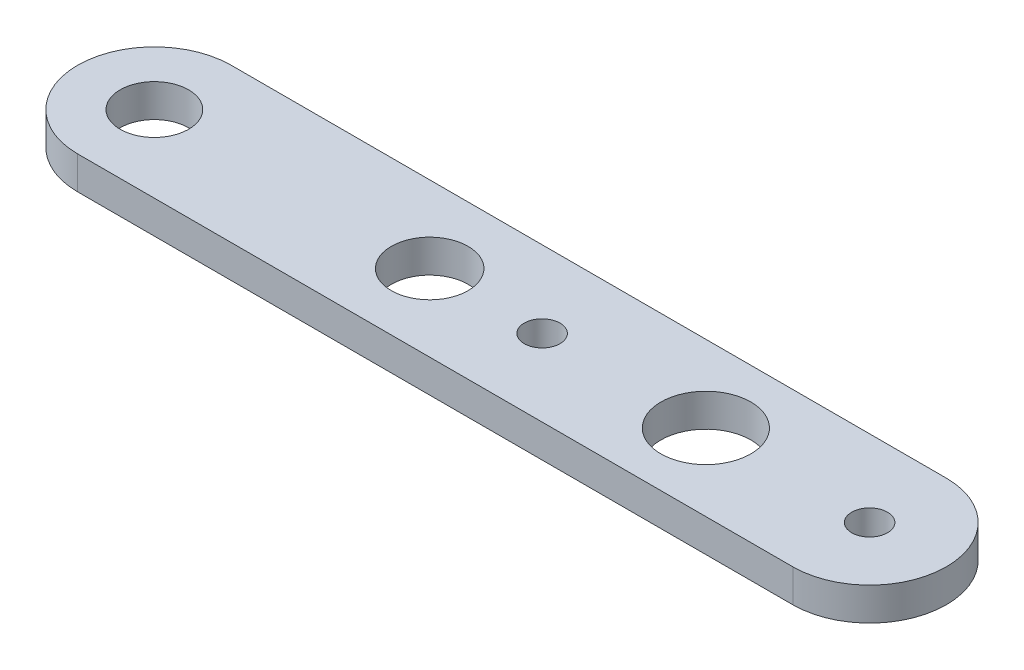
ISO-10303-21;
HEADER;
FILE_DESCRIPTION(('STEP AP214'),'2;1');
FILE_NAME('part.step','',(''),(''),'','','');
FILE_SCHEMA(('AUTOMOTIVE_DESIGN { 1 0 10303 214 1 1 1 1 }'));
ENDSEC;
DATA;
#1=APPLICATION_CONTEXT('core data for automotive mechanical design processes');
#2=APPLICATION_PROTOCOL_DEFINITION('international standard','automotive_design',2000,#1);
#3=PRODUCT_CONTEXT('',#1,'mechanical');
#4=PRODUCT('Part','Part','',(#3));
#5=PRODUCT_RELATED_PRODUCT_CATEGORY('part','',(#4));
#6=PRODUCT_DEFINITION_FORMATION('','',#4);
#7=PRODUCT_DEFINITION_CONTEXT('part definition',#1,'design');
#8=PRODUCT_DEFINITION('design','',#6,#7);
#9=PRODUCT_DEFINITION_SHAPE('','',#8);
#10=(LENGTH_UNIT() NAMED_UNIT(*) SI_UNIT(.MILLI.,.METRE.));
#11=(NAMED_UNIT(*) PLANE_ANGLE_UNIT() SI_UNIT($,.RADIAN.));
#12=(NAMED_UNIT(*) SI_UNIT($,.STERADIAN.) SOLID_ANGLE_UNIT());
#13=UNCERTAINTY_MEASURE_WITH_UNIT(LENGTH_MEASURE(1.E-05),#10,'distance_accuracy_value','');
#14=(GEOMETRIC_REPRESENTATION_CONTEXT(3) GLOBAL_UNCERTAINTY_ASSIGNED_CONTEXT((#13)) GLOBAL_UNIT_ASSIGNED_CONTEXT((#10,
#11,#12)) REPRESENTATION_CONTEXT('',''));
#15=CARTESIAN_POINT('',(0.,0.,0.));
#16=DIRECTION('',(0.,0.,1.));
#17=DIRECTION('',(1.,0.,0.));
#18=AXIS2_PLACEMENT_3D('',#15,#16,#17);
#19=CARTESIAN_POINT('',(0.,3.81,0.));
#20=DIRECTION('',(0.,1.,0.));
#21=DIRECTION('',(0.,0.,1.));
#22=AXIS2_PLACEMENT_3D('',#19,#20,#21);
#23=PLANE('',#22);
#24=CARTESIAN_POINT('',(63.8556,3.81,0.));
#25=DIRECTION('',(0.,1.,0.));
#26=DIRECTION('',(0.,0.,1.));
#27=AXIS2_PLACEMENT_3D('',#24,#25,#26);
#28=CIRCLE('',#27,5.20700000000001);
#29=CARTESIAN_POINT('',(63.8556,3.81,-5.20700000000001));
#30=VERTEX_POINT('',#29);
#31=EDGE_CURVE('E129',#30,#30,#28,.T.);
#32=ORIENTED_EDGE('',*,*,#31,.F.);
#33=EDGE_LOOP('',(#32));
#34=FACE_BOUND('',#33,.T.);
#35=CARTESIAN_POINT('',(82.8167,3.81,0.));
#36=DIRECTION('',(0.,1.,0.));
#37=DIRECTION('',(0.,0.,1.));
#38=AXIS2_PLACEMENT_3D('',#35,#36,#37);
#39=CIRCLE('',#38,2.0701);
#40=CARTESIAN_POINT('',(82.8167,3.81,-2.0701));
#41=VERTEX_POINT('',#40);
#42=EDGE_CURVE('E117',#41,#41,#39,.T.);
#43=ORIENTED_EDGE('',*,*,#42,.F.);
#44=EDGE_LOOP('',(#43));
#45=FACE_BOUND('',#44,.T.);
#46=CARTESIAN_POINT('',(0.,3.81,0.));
#47=DIRECTION('',(0.,1.,0.));
#48=DIRECTION('',(0.,0.,1.));
#49=AXIS2_PLACEMENT_3D('',#46,#47,#48);
#50=CIRCLE('',#49,8.89);
#51=CARTESIAN_POINT('',(0.,3.81,-8.89));
#52=VERTEX_POINT('',#51);
#53=CARTESIAN_POINT('',(0.,3.81,8.89));
#54=VERTEX_POINT('',#53);
#55=EDGE_CURVE('E87',#52,#54,#50,.T.);
#56=ORIENTED_EDGE('',*,*,#55,.T.);
#57=DIRECTION('',(1.,0.,0.));
#58=VECTOR('',#57,1.);
#59=CARTESIAN_POINT('',(0.,3.81,8.89));
#60=LINE('',#59,#58);
#61=CARTESIAN_POINT('',(82.8167,3.81,8.89));
#62=VERTEX_POINT('',#61);
#63=EDGE_CURVE('E82',#54,#62,#60,.T.);
#64=ORIENTED_EDGE('',*,*,#63,.T.);
#65=CARTESIAN_POINT('',(82.8167,3.81,0.));
#66=DIRECTION('',(0.,1.,0.));
#67=DIRECTION('',(0.,0.,1.));
#68=AXIS2_PLACEMENT_3D('',#65,#66,#67);
#69=CIRCLE('',#68,8.89);
#70=CARTESIAN_POINT('',(82.8167,3.81,-8.89));
#71=VERTEX_POINT('',#70);
#72=EDGE_CURVE('E85',#62,#71,#69,.T.);
#73=ORIENTED_EDGE('',*,*,#72,.T.);
#74=DIRECTION('',(-1.,0.,0.));
#75=VECTOR('',#74,1.);
#76=CARTESIAN_POINT('',(0.,3.81,-8.89));
#77=LINE('',#76,#75);
#78=EDGE_CURVE('E52',#71,#52,#77,.T.);
#79=ORIENTED_EDGE('',*,*,#78,.T.);
#80=EDGE_LOOP('',(#56,#64,#73,#79));
#81=FACE_BOUND('',#80,.T.);
#82=CARTESIAN_POINT('',(0.,3.81,0.));
#83=DIRECTION('',(0.,1.,0.));
#84=DIRECTION('',(0.,0.,1.));
#85=AXIS2_PLACEMENT_3D('',#82,#83,#84);
#86=CIRCLE('',#85,3.9624);
#87=CARTESIAN_POINT('',(0.,3.81,-3.9624));
#88=VERTEX_POINT('',#87);
#89=EDGE_CURVE('E102',#88,#88,#86,.T.);
#90=ORIENTED_EDGE('',*,*,#89,.F.);
#91=EDGE_LOOP('',(#90));
#92=FACE_BOUND('',#91,.T.);
#93=CARTESIAN_POINT('',(44.8945,3.81,0.));
#94=DIRECTION('',(0.,1.,0.));
#95=DIRECTION('',(0.,0.,1.));
#96=AXIS2_PLACEMENT_3D('',#93,#94,#95);
#97=CIRCLE('',#96,2.0701);
#98=CARTESIAN_POINT('',(44.8945,3.81,-2.07009999999999));
#99=VERTEX_POINT('',#98);
#100=EDGE_CURVE('E123',#99,#99,#97,.T.);
#101=ORIENTED_EDGE('',*,*,#100,.F.);
#102=EDGE_LOOP('',(#101));
#103=FACE_BOUND('',#102,.T.);
#104=CARTESIAN_POINT('',(31.877,3.81,0.));
#105=DIRECTION('',(0.,1.,0.));
#106=DIRECTION('',(0.,0.,1.));
#107=AXIS2_PLACEMENT_3D('',#104,#105,#106);
#108=CIRCLE('',#107,4.445);
#109=CARTESIAN_POINT('',(31.877,3.81,-4.445));
#110=VERTEX_POINT('',#109);
#111=EDGE_CURVE('E135',#110,#110,#108,.T.);
#112=ORIENTED_EDGE('',*,*,#111,.F.);
#113=EDGE_LOOP('',(#112));
#114=FACE_BOUND('',#113,.T.);
#115=ADVANCED_FACE('F35',(#34,#45,#81,#92,#103,#114),#23,.T.);
#116=CARTESIAN_POINT('',(0.,0.,0.));
#117=DIRECTION('',(0.,1.,0.));
#118=DIRECTION('',(0.,0.,1.));
#119=AXIS2_PLACEMENT_3D('',#116,#117,#118);
#120=PLANE('',#119);
#121=CARTESIAN_POINT('',(0.,0.,0.));
#122=DIRECTION('',(0.,1.,0.));
#123=DIRECTION('',(0.,0.,1.));
#124=AXIS2_PLACEMENT_3D('',#121,#122,#123);
#125=CIRCLE('',#124,8.89);
#126=CARTESIAN_POINT('',(0.,0.,-8.89));
#127=VERTEX_POINT('',#126);
#128=CARTESIAN_POINT('',(0.,0.,8.89));
#129=VERTEX_POINT('',#128);
#130=EDGE_CURVE('E99',#127,#129,#125,.T.);
#131=ORIENTED_EDGE('',*,*,#130,.F.);
#132=DIRECTION('',(-1.,0.,0.));
#133=VECTOR('',#132,1.);
#134=CARTESIAN_POINT('',(0.,0.,-8.89));
#135=LINE('',#134,#133);
#136=CARTESIAN_POINT('',(82.8167,0.,-8.89));
#137=VERTEX_POINT('',#136);
#138=EDGE_CURVE('E75',#137,#127,#135,.T.);
#139=ORIENTED_EDGE('',*,*,#138,.F.);
#140=CARTESIAN_POINT('',(82.8167,0.,0.));
#141=DIRECTION('',(0.,1.,0.));
#142=DIRECTION('',(0.,0.,1.));
#143=AXIS2_PLACEMENT_3D('',#140,#141,#142);
#144=CIRCLE('',#143,8.89);
#145=CARTESIAN_POINT('',(82.8167,0.,8.89));
#146=VERTEX_POINT('',#145);
#147=EDGE_CURVE('E69',#146,#137,#144,.T.);
#148=ORIENTED_EDGE('',*,*,#147,.F.);
#149=DIRECTION('',(1.,0.,0.));
#150=VECTOR('',#149,1.);
#151=CARTESIAN_POINT('',(0.,0.,8.89));
#152=LINE('',#151,#150);
#153=EDGE_CURVE('E91',#129,#146,#152,.T.);
#154=ORIENTED_EDGE('',*,*,#153,.F.);
#155=EDGE_LOOP('',(#131,#139,#148,#154));
#156=FACE_BOUND('',#155,.T.);
#157=CARTESIAN_POINT('',(0.,0.,0.));
#158=DIRECTION('',(0.,1.,0.));
#159=DIRECTION('',(0.,0.,1.));
#160=AXIS2_PLACEMENT_3D('',#157,#158,#159);
#161=CIRCLE('',#160,3.9624);
#162=CARTESIAN_POINT('',(0.,0.,-3.9624));
#163=VERTEX_POINT('',#162);
#164=EDGE_CURVE('E114',#163,#163,#161,.T.);
#165=ORIENTED_EDGE('',*,*,#164,.T.);
#166=EDGE_LOOP('',(#165));
#167=FACE_BOUND('',#166,.T.);
#168=CARTESIAN_POINT('',(82.8167,0.,0.));
#169=DIRECTION('',(0.,1.,0.));
#170=DIRECTION('',(0.,0.,1.));
#171=AXIS2_PLACEMENT_3D('',#168,#169,#170);
#172=CIRCLE('',#171,2.0701);
#173=CARTESIAN_POINT('',(82.8167,0.,-2.0701));
#174=VERTEX_POINT('',#173);
#175=EDGE_CURVE('E120',#174,#174,#172,.T.);
#176=ORIENTED_EDGE('',*,*,#175,.T.);
#177=EDGE_LOOP('',(#176));
#178=FACE_BOUND('',#177,.T.);
#179=CARTESIAN_POINT('',(44.8945,0.,0.));
#180=DIRECTION('',(0.,1.,0.));
#181=DIRECTION('',(0.,0.,1.));
#182=AXIS2_PLACEMENT_3D('',#179,#180,#181);
#183=CIRCLE('',#182,2.0701);
#184=CARTESIAN_POINT('',(44.8945,0.,-2.07009999999999));
#185=VERTEX_POINT('',#184);
#186=EDGE_CURVE('E126',#185,#185,#183,.T.);
#187=ORIENTED_EDGE('',*,*,#186,.T.);
#188=EDGE_LOOP('',(#187));
#189=FACE_BOUND('',#188,.T.);
#190=CARTESIAN_POINT('',(63.8556,0.,0.));
#191=DIRECTION('',(0.,1.,0.));
#192=DIRECTION('',(0.,0.,1.));
#193=AXIS2_PLACEMENT_3D('',#190,#191,#192);
#194=CIRCLE('',#193,5.20700000000001);
#195=CARTESIAN_POINT('',(63.8556,0.,-5.20700000000001));
#196=VERTEX_POINT('',#195);
#197=EDGE_CURVE('E132',#196,#196,#194,.T.);
#198=ORIENTED_EDGE('',*,*,#197,.T.);
#199=EDGE_LOOP('',(#198));
#200=FACE_BOUND('',#199,.T.);
#201=CARTESIAN_POINT('',(31.877,0.,0.));
#202=DIRECTION('',(0.,1.,0.));
#203=DIRECTION('',(0.,0.,1.));
#204=AXIS2_PLACEMENT_3D('',#201,#202,#203);
#205=CIRCLE('',#204,4.445);
#206=CARTESIAN_POINT('',(31.877,0.,-4.445));
#207=VERTEX_POINT('',#206);
#208=EDGE_CURVE('E138',#207,#207,#205,.T.);
#209=ORIENTED_EDGE('',*,*,#208,.T.);
#210=EDGE_LOOP('',(#209));
#211=FACE_BOUND('',#210,.T.);
#212=ADVANCED_FACE('F110',(#156,#167,#178,#189,#200,#211),#120,.F.);
#213=CARTESIAN_POINT('',(0.,3.81,0.));
#214=DIRECTION('',(0.,-1.,0.));
#215=DIRECTION('',(0.,0.,-1.));
#216=AXIS2_PLACEMENT_3D('',#213,#214,#215);
#217=CYLINDRICAL_SURFACE('',#216,8.89);
#218=ORIENTED_EDGE('',*,*,#130,.T.);
#219=DIRECTION('',(0.,-1.,0.));
#220=VECTOR('',#219,1.);
#221=CARTESIAN_POINT('',(0.,3.81,8.89));
#222=LINE('',#221,#220);
#223=EDGE_CURVE('E11',#54,#129,#222,.T.);
#224=ORIENTED_EDGE('',*,*,#223,.F.);
#225=ORIENTED_EDGE('',*,*,#55,.F.);
#226=DIRECTION('',(0.,-1.,0.));
#227=VECTOR('',#226,1.);
#228=CARTESIAN_POINT('',(0.,3.81,-8.89));
#229=LINE('',#228,#227);
#230=EDGE_CURVE('E95',#52,#127,#229,.T.);
#231=ORIENTED_EDGE('',*,*,#230,.T.);
#232=EDGE_LOOP('',(#218,#224,#225,#231));
#233=FACE_BOUND('',#232,.T.);
#234=ADVANCED_FACE('F37',(#233),#217,.T.);
#235=CARTESIAN_POINT('',(0.,3.81,8.89));
#236=DIRECTION('',(0.,0.,-1.));
#237=DIRECTION('',(-1.,0.,0.));
#238=AXIS2_PLACEMENT_3D('',#235,#236,#237);
#239=PLANE('',#238);
#240=ORIENTED_EDGE('',*,*,#153,.T.);
#241=DIRECTION('',(0.,-1.,0.));
#242=VECTOR('',#241,1.);
#243=CARTESIAN_POINT('',(82.8167,3.81,8.89));
#244=LINE('',#243,#242);
#245=EDGE_CURVE('E44',#62,#146,#244,.T.);
#246=ORIENTED_EDGE('',*,*,#245,.F.);
#247=ORIENTED_EDGE('',*,*,#63,.F.);
#248=ORIENTED_EDGE('',*,*,#223,.T.);
#249=EDGE_LOOP('',(#240,#246,#247,#248));
#250=FACE_BOUND('',#249,.T.);
#251=ADVANCED_FACE('F90',(#250),#239,.F.);
#252=CARTESIAN_POINT('',(82.8167,3.81,0.));
#253=DIRECTION('',(0.,-1.,0.));
#254=DIRECTION('',(0.,0.,-1.));
#255=AXIS2_PLACEMENT_3D('',#252,#253,#254);
#256=CYLINDRICAL_SURFACE('',#255,8.89);
#257=ORIENTED_EDGE('',*,*,#147,.T.);
#258=DIRECTION('',(0.,-1.,0.));
#259=VECTOR('',#258,1.);
#260=CARTESIAN_POINT('',(82.8167,3.81,-8.89));
#261=LINE('',#260,#259);
#262=EDGE_CURVE('E92',#71,#137,#261,.T.);
#263=ORIENTED_EDGE('',*,*,#262,.F.);
#264=ORIENTED_EDGE('',*,*,#72,.F.);
#265=ORIENTED_EDGE('',*,*,#245,.T.);
#266=EDGE_LOOP('',(#257,#263,#264,#265));
#267=FACE_BOUND('',#266,.T.);
#268=ADVANCED_FACE('F93',(#267),#256,.T.);
#269=CARTESIAN_POINT('',(0.,3.81,-8.89));
#270=DIRECTION('',(0.,0.,1.));
#271=DIRECTION('',(1.,0.,0.));
#272=AXIS2_PLACEMENT_3D('',#269,#270,#271);
#273=PLANE('',#272);
#274=ORIENTED_EDGE('',*,*,#138,.T.);
#275=ORIENTED_EDGE('',*,*,#230,.F.);
#276=ORIENTED_EDGE('',*,*,#78,.F.);
#277=ORIENTED_EDGE('',*,*,#262,.T.);
#278=EDGE_LOOP('',(#274,#275,#276,#277));
#279=FACE_BOUND('',#278,.T.);
#280=ADVANCED_FACE('F107',(#279),#273,.F.);
#281=CARTESIAN_POINT('',(0.,3.81,0.));
#282=DIRECTION('',(0.,-1.,0.));
#283=DIRECTION('',(0.,0.,-1.));
#284=AXIS2_PLACEMENT_3D('',#281,#282,#283);
#285=CYLINDRICAL_SURFACE('',#284,3.9624);
#286=CARTESIAN_POINT('',(0.,3.81,-3.9624));
#287=CARTESIAN_POINT('',(0.,3.7703125,-3.9624));
#288=CARTESIAN_POINT('',(0.,3.730625,-3.9624));
#289=CARTESIAN_POINT('',(0.,3.65125,-3.9624));
#290=CARTESIAN_POINT('',(0.,3.6115625,-3.9624));
#291=CARTESIAN_POINT('',(0.,3.5321875,-3.9624));
#292=CARTESIAN_POINT('',(0.,3.4925,-3.9624));
#293=CARTESIAN_POINT('',(0.,3.413125,-3.9624));
#294=CARTESIAN_POINT('',(0.,3.3734375,-3.9624));
#295=CARTESIAN_POINT('',(0.,3.2940625,-3.9624));
#296=CARTESIAN_POINT('',(0.,3.254375,-3.9624));
#297=CARTESIAN_POINT('',(0.,3.175,-3.9624));
#298=CARTESIAN_POINT('',(0.,3.1353125,-3.9624));
#299=CARTESIAN_POINT('',(0.,3.0559375,-3.9624));
#300=CARTESIAN_POINT('',(0.,3.01625,-3.9624));
#301=CARTESIAN_POINT('',(0.,2.936875,-3.9624));
#302=CARTESIAN_POINT('',(0.,2.8971875,-3.9624));
#303=CARTESIAN_POINT('',(0.,2.8178125,-3.9624));
#304=CARTESIAN_POINT('',(0.,2.778125,-3.9624));
#305=CARTESIAN_POINT('',(0.,2.69875,-3.9624));
#306=CARTESIAN_POINT('',(0.,2.6590625,-3.9624));
#307=CARTESIAN_POINT('',(0.,2.5796875,-3.9624));
#308=CARTESIAN_POINT('',(0.,2.54,-3.9624));
#309=CARTESIAN_POINT('',(0.,2.460625,-3.9624));
#310=CARTESIAN_POINT('',(0.,2.4209375,-3.9624));
#311=CARTESIAN_POINT('',(0.,2.3415625,-3.9624));
#312=CARTESIAN_POINT('',(0.,2.301875,-3.9624));
#313=CARTESIAN_POINT('',(0.,2.2225,-3.9624));
#314=CARTESIAN_POINT('',(0.,2.1828125,-3.9624));
#315=CARTESIAN_POINT('',(0.,2.1034375,-3.9624));
#316=CARTESIAN_POINT('',(0.,2.06375,-3.9624));
#317=CARTESIAN_POINT('',(0.,1.984375,-3.9624));
#318=CARTESIAN_POINT('',(0.,1.9446875,-3.9624));
#319=CARTESIAN_POINT('',(0.,1.8653125,-3.9624));
#320=CARTESIAN_POINT('',(0.,1.825625,-3.9624));
#321=CARTESIAN_POINT('',(0.,1.74625,-3.9624));
#322=CARTESIAN_POINT('',(0.,1.7065625,-3.9624));
#323=CARTESIAN_POINT('',(0.,1.6271875,-3.9624));
#324=CARTESIAN_POINT('',(0.,1.5875,-3.9624));
#325=CARTESIAN_POINT('',(0.,1.508125,-3.9624));
#326=CARTESIAN_POINT('',(0.,1.4684375,-3.9624));
#327=CARTESIAN_POINT('',(0.,1.3890625,-3.9624));
#328=CARTESIAN_POINT('',(0.,1.349375,-3.9624));
#329=CARTESIAN_POINT('',(0.,1.27,-3.9624));
#330=CARTESIAN_POINT('',(0.,1.2303125,-3.9624));
#331=CARTESIAN_POINT('',(0.,1.1509375,-3.9624));
#332=CARTESIAN_POINT('',(0.,1.11125,-3.9624));
#333=CARTESIAN_POINT('',(0.,1.031875,-3.9624));
#334=CARTESIAN_POINT('',(0.,0.9921875,-3.9624));
#335=CARTESIAN_POINT('',(0.,0.9128125,-3.9624));
#336=CARTESIAN_POINT('',(0.,0.873125,-3.9624));
#337=CARTESIAN_POINT('',(0.,0.79375,-3.9624));
#338=CARTESIAN_POINT('',(0.,0.7540625,-3.9624));
#339=CARTESIAN_POINT('',(0.,0.6746875,-3.9624));
#340=CARTESIAN_POINT('',(0.,0.635,-3.9624));
#341=CARTESIAN_POINT('',(0.,0.555625,-3.9624));
#342=CARTESIAN_POINT('',(0.,0.5159375,-3.9624));
#343=CARTESIAN_POINT('',(0.,0.4365625,-3.9624));
#344=CARTESIAN_POINT('',(0.,0.396875,-3.9624));
#345=CARTESIAN_POINT('',(0.,0.3175,-3.9624));
#346=CARTESIAN_POINT('',(0.,0.2778125,-3.9624));
#347=CARTESIAN_POINT('',(0.,0.1984375,-3.9624));
#348=CARTESIAN_POINT('',(0.,0.15875,-3.9624));
#349=CARTESIAN_POINT('',(0.,0.0793749999999999,-3.9624));
#350=CARTESIAN_POINT('',(0.,0.0396874999999999,-3.9624));
#351=CARTESIAN_POINT('',(0.,0.,-3.9624));
#352=B_SPLINE_CURVE_WITH_KNOTS('',3,(#286,#287,#288,#289,#290,#291,#292,#293,#294,#295,#296,
#297,#298,#299,#300,#301,#302,#303,#304,#305,#306,#307,#308,#309,#310,#311,#312,#313,#314,#315,
#316,#317,#318,#319,#320,#321,#322,#323,#324,#325,#326,#327,#328,#329,#330,#331,#332,#333,#334,
#335,#336,#337,#338,#339,#340,#341,#342,#343,#344,#345,#346,#347,#348,#349,#350,#351),
.UNSPECIFIED.,.F.,.F.,(4,2,2,2,2,2,2,2,2,2,2,2,2,2,2,2,2,2,2,2,2,2,2,2,2,2,2,2,2,2,2,2,4),(0.,
0.1190625,0.238125,0.3571875,0.47625,0.595312499999999,0.714375,0.833437499999999,
0.952499999999999,1.0715625,1.190625,1.3096875,1.42875,1.5478125,1.666875,1.7859375,1.905,
2.0240625,2.143125,2.2621875,2.38125,2.5003125,2.619375,2.7384375,2.8575,2.9765625,3.095625,
3.2146875,3.33375,3.4528125,3.571875,3.6909375,3.81),.UNSPECIFIED.);
#353=EDGE_CURVE('BSEAM157',#88,#163,#352,.T.);
#354=ORIENTED_EDGE('',*,*,#89,.T.);
#355=ORIENTED_EDGE('',*,*,#164,.F.);
#356=ORIENTED_EDGE('',*,*,#353,.T.);
#357=ORIENTED_EDGE('',*,*,#353,.F.);
#358=EDGE_LOOP('',(#354,#356,#355,#357));
#359=FACE_BOUND('',#358,.T.);
#360=ADVANCED_FACE('F157',(#359),#285,.F.);
#361=CARTESIAN_POINT('',(82.8167,3.81,0.));
#362=DIRECTION('',(0.,-1.,0.));
#363=DIRECTION('',(0.,0.,-1.));
#364=AXIS2_PLACEMENT_3D('',#361,#362,#363);
#365=CYLINDRICAL_SURFACE('',#364,2.0701);
#366=CARTESIAN_POINT('',(82.8167,3.81,-2.0701));
#367=CARTESIAN_POINT('',(82.8167,3.7703125,-2.0701));
#368=CARTESIAN_POINT('',(82.8167,3.730625,-2.0701));
#369=CARTESIAN_POINT('',(82.8167,3.65125,-2.0701));
#370=CARTESIAN_POINT('',(82.8167,3.6115625,-2.0701));
#371=CARTESIAN_POINT('',(82.8167,3.5321875,-2.0701));
#372=CARTESIAN_POINT('',(82.8167,3.4925,-2.0701));
#373=CARTESIAN_POINT('',(82.8167,3.413125,-2.0701));
#374=CARTESIAN_POINT('',(82.8167,3.3734375,-2.0701));
#375=CARTESIAN_POINT('',(82.8167,3.2940625,-2.0701));
#376=CARTESIAN_POINT('',(82.8167,3.254375,-2.0701));
#377=CARTESIAN_POINT('',(82.8167,3.175,-2.0701));
#378=CARTESIAN_POINT('',(82.8167,3.1353125,-2.0701));
#379=CARTESIAN_POINT('',(82.8167,3.0559375,-2.0701));
#380=CARTESIAN_POINT('',(82.8167,3.01625,-2.0701));
#381=CARTESIAN_POINT('',(82.8167,2.936875,-2.0701));
#382=CARTESIAN_POINT('',(82.8167,2.8971875,-2.0701));
#383=CARTESIAN_POINT('',(82.8167,2.8178125,-2.0701));
#384=CARTESIAN_POINT('',(82.8167,2.778125,-2.0701));
#385=CARTESIAN_POINT('',(82.8167,2.69875,-2.0701));
#386=CARTESIAN_POINT('',(82.8167,2.6590625,-2.0701));
#387=CARTESIAN_POINT('',(82.8167,2.5796875,-2.0701));
#388=CARTESIAN_POINT('',(82.8167,2.54,-2.0701));
#389=CARTESIAN_POINT('',(82.8167,2.460625,-2.0701));
#390=CARTESIAN_POINT('',(82.8167,2.4209375,-2.0701));
#391=CARTESIAN_POINT('',(82.8167,2.3415625,-2.0701));
#392=CARTESIAN_POINT('',(82.8167,2.301875,-2.0701));
#393=CARTESIAN_POINT('',(82.8167,2.2225,-2.0701));
#394=CARTESIAN_POINT('',(82.8167,2.1828125,-2.0701));
#395=CARTESIAN_POINT('',(82.8167,2.1034375,-2.0701));
#396=CARTESIAN_POINT('',(82.8167,2.06375,-2.0701));
#397=CARTESIAN_POINT('',(82.8167,1.984375,-2.0701));
#398=CARTESIAN_POINT('',(82.8167,1.9446875,-2.0701));
#399=CARTESIAN_POINT('',(82.8167,1.8653125,-2.0701));
#400=CARTESIAN_POINT('',(82.8167,1.825625,-2.0701));
#401=CARTESIAN_POINT('',(82.8167,1.74625,-2.0701));
#402=CARTESIAN_POINT('',(82.8167,1.7065625,-2.0701));
#403=CARTESIAN_POINT('',(82.8167,1.6271875,-2.0701));
#404=CARTESIAN_POINT('',(82.8167,1.5875,-2.0701));
#405=CARTESIAN_POINT('',(82.8167,1.508125,-2.0701));
#406=CARTESIAN_POINT('',(82.8167,1.4684375,-2.0701));
#407=CARTESIAN_POINT('',(82.8167,1.3890625,-2.0701));
#408=CARTESIAN_POINT('',(82.8167,1.349375,-2.0701));
#409=CARTESIAN_POINT('',(82.8167,1.27,-2.0701));
#410=CARTESIAN_POINT('',(82.8167,1.2303125,-2.0701));
#411=CARTESIAN_POINT('',(82.8167,1.1509375,-2.0701));
#412=CARTESIAN_POINT('',(82.8167,1.11125,-2.0701));
#413=CARTESIAN_POINT('',(82.8167,1.031875,-2.0701));
#414=CARTESIAN_POINT('',(82.8167,0.9921875,-2.0701));
#415=CARTESIAN_POINT('',(82.8167,0.9128125,-2.0701));
#416=CARTESIAN_POINT('',(82.8167,0.873125,-2.0701));
#417=CARTESIAN_POINT('',(82.8167,0.79375,-2.0701));
#418=CARTESIAN_POINT('',(82.8167,0.7540625,-2.0701));
#419=CARTESIAN_POINT('',(82.8167,0.6746875,-2.0701));
#420=CARTESIAN_POINT('',(82.8167,0.635,-2.0701));
#421=CARTESIAN_POINT('',(82.8167,0.555625,-2.0701));
#422=CARTESIAN_POINT('',(82.8167,0.5159375,-2.0701));
#423=CARTESIAN_POINT('',(82.8167,0.4365625,-2.0701));
#424=CARTESIAN_POINT('',(82.8167,0.396875,-2.0701));
#425=CARTESIAN_POINT('',(82.8167,0.3175,-2.0701));
#426=CARTESIAN_POINT('',(82.8167,0.2778125,-2.0701));
#427=CARTESIAN_POINT('',(82.8167,0.1984375,-2.0701));
#428=CARTESIAN_POINT('',(82.8167,0.15875,-2.0701));
#429=CARTESIAN_POINT('',(82.8167,0.0793749999999999,-2.0701));
#430=CARTESIAN_POINT('',(82.8167,0.0396874999999999,-2.0701));
#431=CARTESIAN_POINT('',(82.8167,0.,-2.0701));
#432=B_SPLINE_CURVE_WITH_KNOTS('',3,(#366,#367,#368,#369,#370,#371,#372,#373,#374,#375,#376,
#377,#378,#379,#380,#381,#382,#383,#384,#385,#386,#387,#388,#389,#390,#391,#392,#393,#394,#395,
#396,#397,#398,#399,#400,#401,#402,#403,#404,#405,#406,#407,#408,#409,#410,#411,#412,#413,#414,
#415,#416,#417,#418,#419,#420,#421,#422,#423,#424,#425,#426,#427,#428,#429,#430,#431),
.UNSPECIFIED.,.F.,.F.,(4,2,2,2,2,2,2,2,2,2,2,2,2,2,2,2,2,2,2,2,2,2,2,2,2,2,2,2,2,2,2,2,4),(0.,
0.1190625,0.238125,0.3571875,0.47625,0.595312499999999,0.714375,0.833437499999999,
0.952499999999999,1.0715625,1.190625,1.3096875,1.42875,1.5478125,1.666875,1.7859375,1.905,
2.0240625,2.143125,2.2621875,2.38125,2.5003125,2.619375,2.7384375,2.8575,2.9765625,3.095625,
3.2146875,3.33375,3.4528125,3.571875,3.6909375,3.81),.UNSPECIFIED.);
#433=EDGE_CURVE('BSEAM203',#41,#174,#432,.T.);
#434=ORIENTED_EDGE('',*,*,#42,.T.);
#435=ORIENTED_EDGE('',*,*,#175,.F.);
#436=ORIENTED_EDGE('',*,*,#433,.T.);
#437=ORIENTED_EDGE('',*,*,#433,.F.);
#438=EDGE_LOOP('',(#434,#436,#435,#437));
#439=FACE_BOUND('',#438,.T.);
#440=ADVANCED_FACE('F203',(#439),#365,.F.);
#441=CARTESIAN_POINT('',(44.8945,3.81,0.));
#442=DIRECTION('',(0.,-1.,0.));
#443=DIRECTION('',(0.,0.,-1.));
#444=AXIS2_PLACEMENT_3D('',#441,#442,#443);
#445=CYLINDRICAL_SURFACE('',#444,2.0701);
#446=CARTESIAN_POINT('',(44.8945,3.81,-2.07009999999999));
#447=CARTESIAN_POINT('',(44.8945,3.7703125,-2.07009999999999));
#448=CARTESIAN_POINT('',(44.8945,3.730625,-2.07009999999999));
#449=CARTESIAN_POINT('',(44.8945,3.65125,-2.07009999999999));
#450=CARTESIAN_POINT('',(44.8945,3.6115625,-2.07009999999999));
#451=CARTESIAN_POINT('',(44.8945,3.5321875,-2.07009999999999));
#452=CARTESIAN_POINT('',(44.8945,3.4925,-2.07009999999999));
#453=CARTESIAN_POINT('',(44.8945,3.413125,-2.07009999999999));
#454=CARTESIAN_POINT('',(44.8945,3.3734375,-2.07009999999999));
#455=CARTESIAN_POINT('',(44.8945,3.2940625,-2.07009999999999));
#456=CARTESIAN_POINT('',(44.8945,3.254375,-2.07009999999999));
#457=CARTESIAN_POINT('',(44.8945,3.175,-2.07009999999999));
#458=CARTESIAN_POINT('',(44.8945,3.1353125,-2.07009999999999));
#459=CARTESIAN_POINT('',(44.8945,3.0559375,-2.07009999999999));
#460=CARTESIAN_POINT('',(44.8945,3.01625,-2.07009999999999));
#461=CARTESIAN_POINT('',(44.8945,2.936875,-2.07009999999999));
#462=CARTESIAN_POINT('',(44.8945,2.8971875,-2.07009999999999));
#463=CARTESIAN_POINT('',(44.8945,2.8178125,-2.07009999999999));
#464=CARTESIAN_POINT('',(44.8945,2.778125,-2.07009999999999));
#465=CARTESIAN_POINT('',(44.8945,2.69875,-2.07009999999999));
#466=CARTESIAN_POINT('',(44.8945,2.6590625,-2.07009999999999));
#467=CARTESIAN_POINT('',(44.8945,2.5796875,-2.07009999999999));
#468=CARTESIAN_POINT('',(44.8945,2.54,-2.07009999999999));
#469=CARTESIAN_POINT('',(44.8945,2.460625,-2.07009999999999));
#470=CARTESIAN_POINT('',(44.8945,2.4209375,-2.07009999999999));
#471=CARTESIAN_POINT('',(44.8945,2.3415625,-2.07009999999999));
#472=CARTESIAN_POINT('',(44.8945,2.301875,-2.07009999999999));
#473=CARTESIAN_POINT('',(44.8945,2.2225,-2.07009999999999));
#474=CARTESIAN_POINT('',(44.8945,2.1828125,-2.07009999999999));
#475=CARTESIAN_POINT('',(44.8945,2.1034375,-2.07009999999999));
#476=CARTESIAN_POINT('',(44.8945,2.06375,-2.07009999999999));
#477=CARTESIAN_POINT('',(44.8945,1.984375,-2.07009999999999));
#478=CARTESIAN_POINT('',(44.8945,1.9446875,-2.07009999999999));
#479=CARTESIAN_POINT('',(44.8945,1.8653125,-2.07009999999999));
#480=CARTESIAN_POINT('',(44.8945,1.825625,-2.07009999999999));
#481=CARTESIAN_POINT('',(44.8945,1.74625,-2.07009999999999));
#482=CARTESIAN_POINT('',(44.8945,1.7065625,-2.07009999999999));
#483=CARTESIAN_POINT('',(44.8945,1.6271875,-2.07009999999999));
#484=CARTESIAN_POINT('',(44.8945,1.5875,-2.07009999999999));
#485=CARTESIAN_POINT('',(44.8945,1.508125,-2.07009999999999));
#486=CARTESIAN_POINT('',(44.8945,1.4684375,-2.07009999999999));
#487=CARTESIAN_POINT('',(44.8945,1.3890625,-2.07009999999999));
#488=CARTESIAN_POINT('',(44.8945,1.349375,-2.07009999999999));
#489=CARTESIAN_POINT('',(44.8945,1.27,-2.07009999999999));
#490=CARTESIAN_POINT('',(44.8945,1.2303125,-2.07009999999999));
#491=CARTESIAN_POINT('',(44.8945,1.1509375,-2.07009999999999));
#492=CARTESIAN_POINT('',(44.8945,1.11125,-2.07009999999999));
#493=CARTESIAN_POINT('',(44.8945,1.031875,-2.07009999999999));
#494=CARTESIAN_POINT('',(44.8945,0.9921875,-2.07009999999999));
#495=CARTESIAN_POINT('',(44.8945,0.9128125,-2.07009999999999));
#496=CARTESIAN_POINT('',(44.8945,0.873125,-2.07009999999999));
#497=CARTESIAN_POINT('',(44.8945,0.79375,-2.07009999999999));
#498=CARTESIAN_POINT('',(44.8945,0.7540625,-2.07009999999999));
#499=CARTESIAN_POINT('',(44.8945,0.6746875,-2.07009999999999));
#500=CARTESIAN_POINT('',(44.8945,0.635,-2.07009999999999));
#501=CARTESIAN_POINT('',(44.8945,0.555625,-2.07009999999999));
#502=CARTESIAN_POINT('',(44.8945,0.5159375,-2.07009999999999));
#503=CARTESIAN_POINT('',(44.8945,0.4365625,-2.07009999999999));
#504=CARTESIAN_POINT('',(44.8945,0.396875,-2.07009999999999));
#505=CARTESIAN_POINT('',(44.8945,0.3175,-2.07009999999999));
#506=CARTESIAN_POINT('',(44.8945,0.2778125,-2.07009999999999));
#507=CARTESIAN_POINT('',(44.8945,0.1984375,-2.07009999999999));
#508=CARTESIAN_POINT('',(44.8945,0.15875,-2.07009999999999));
#509=CARTESIAN_POINT('',(44.8945,0.0793749999999999,-2.07009999999999));
#510=CARTESIAN_POINT('',(44.8945,0.0396874999999999,-2.07009999999999));
#511=CARTESIAN_POINT('',(44.8945,0.,-2.07009999999999));
#512=B_SPLINE_CURVE_WITH_KNOTS('',3,(#446,#447,#448,#449,#450,#451,#452,#453,#454,#455,#456,
#457,#458,#459,#460,#461,#462,#463,#464,#465,#466,#467,#468,#469,#470,#471,#472,#473,#474,#475,
#476,#477,#478,#479,#480,#481,#482,#483,#484,#485,#486,#487,#488,#489,#490,#491,#492,#493,#494,
#495,#496,#497,#498,#499,#500,#501,#502,#503,#504,#505,#506,#507,#508,#509,#510,#511),
.UNSPECIFIED.,.F.,.F.,(4,2,2,2,2,2,2,2,2,2,2,2,2,2,2,2,2,2,2,2,2,2,2,2,2,2,2,2,2,2,2,2,4),(0.,
0.1190625,0.238125,0.3571875,0.47625,0.595312499999999,0.714375,0.833437499999999,
0.952499999999999,1.0715625,1.190625,1.3096875,1.42875,1.5478125,1.666875,1.7859375,1.905,
2.0240625,2.143125,2.2621875,2.38125,2.5003125,2.619375,2.7384375,2.8575,2.9765625,3.095625,
3.2146875,3.33375,3.4528125,3.571875,3.6909375,3.81),.UNSPECIFIED.);
#513=EDGE_CURVE('BSEAM211',#99,#185,#512,.T.);
#514=ORIENTED_EDGE('',*,*,#100,.T.);
#515=ORIENTED_EDGE('',*,*,#186,.F.);
#516=ORIENTED_EDGE('',*,*,#513,.T.);
#517=ORIENTED_EDGE('',*,*,#513,.F.);
#518=EDGE_LOOP('',(#514,#516,#515,#517));
#519=FACE_BOUND('',#518,.T.);
#520=ADVANCED_FACE('F211',(#519),#445,.F.);
#521=CARTESIAN_POINT('',(63.8556,3.81,0.));
#522=DIRECTION('',(0.,-1.,0.));
#523=DIRECTION('',(0.,0.,-1.));
#524=AXIS2_PLACEMENT_3D('',#521,#522,#523);
#525=CYLINDRICAL_SURFACE('',#524,5.20700000000001);
#526=CARTESIAN_POINT('',(63.8556,3.81,-5.20700000000001));
#527=CARTESIAN_POINT('',(63.8556,3.7703125,-5.20700000000001));
#528=CARTESIAN_POINT('',(63.8556,3.730625,-5.20700000000001));
#529=CARTESIAN_POINT('',(63.8556,3.65125,-5.20700000000001));
#530=CARTESIAN_POINT('',(63.8556,3.6115625,-5.20700000000001));
#531=CARTESIAN_POINT('',(63.8556,3.5321875,-5.20700000000001));
#532=CARTESIAN_POINT('',(63.8556,3.4925,-5.20700000000001));
#533=CARTESIAN_POINT('',(63.8556,3.413125,-5.20700000000001));
#534=CARTESIAN_POINT('',(63.8556,3.3734375,-5.20700000000001));
#535=CARTESIAN_POINT('',(63.8556,3.2940625,-5.20700000000001));
#536=CARTESIAN_POINT('',(63.8556,3.254375,-5.20700000000001));
#537=CARTESIAN_POINT('',(63.8556,3.175,-5.20700000000001));
#538=CARTESIAN_POINT('',(63.8556,3.1353125,-5.20700000000001));
#539=CARTESIAN_POINT('',(63.8556,3.0559375,-5.20700000000001));
#540=CARTESIAN_POINT('',(63.8556,3.01625,-5.20700000000001));
#541=CARTESIAN_POINT('',(63.8556,2.936875,-5.20700000000001));
#542=CARTESIAN_POINT('',(63.8556,2.8971875,-5.20700000000001));
#543=CARTESIAN_POINT('',(63.8556,2.8178125,-5.20700000000001));
#544=CARTESIAN_POINT('',(63.8556,2.778125,-5.20700000000001));
#545=CARTESIAN_POINT('',(63.8556,2.69875,-5.20700000000001));
#546=CARTESIAN_POINT('',(63.8556,2.6590625,-5.20700000000001));
#547=CARTESIAN_POINT('',(63.8556,2.5796875,-5.20700000000001));
#548=CARTESIAN_POINT('',(63.8556,2.54,-5.20700000000001));
#549=CARTESIAN_POINT('',(63.8556,2.460625,-5.20700000000001));
#550=CARTESIAN_POINT('',(63.8556,2.4209375,-5.20700000000001));
#551=CARTESIAN_POINT('',(63.8556,2.3415625,-5.20700000000001));
#552=CARTESIAN_POINT('',(63.8556,2.301875,-5.20700000000001));
#553=CARTESIAN_POINT('',(63.8556,2.2225,-5.20700000000001));
#554=CARTESIAN_POINT('',(63.8556,2.1828125,-5.20700000000001));
#555=CARTESIAN_POINT('',(63.8556,2.1034375,-5.20700000000001));
#556=CARTESIAN_POINT('',(63.8556,2.06375,-5.20700000000001));
#557=CARTESIAN_POINT('',(63.8556,1.984375,-5.20700000000001));
#558=CARTESIAN_POINT('',(63.8556,1.9446875,-5.20700000000001));
#559=CARTESIAN_POINT('',(63.8556,1.8653125,-5.20700000000001));
#560=CARTESIAN_POINT('',(63.8556,1.825625,-5.20700000000001));
#561=CARTESIAN_POINT('',(63.8556,1.74625,-5.20700000000001));
#562=CARTESIAN_POINT('',(63.8556,1.7065625,-5.20700000000001));
#563=CARTESIAN_POINT('',(63.8556,1.6271875,-5.20700000000001));
#564=CARTESIAN_POINT('',(63.8556,1.5875,-5.20700000000001));
#565=CARTESIAN_POINT('',(63.8556,1.508125,-5.20700000000001));
#566=CARTESIAN_POINT('',(63.8556,1.4684375,-5.20700000000001));
#567=CARTESIAN_POINT('',(63.8556,1.3890625,-5.20700000000001));
#568=CARTESIAN_POINT('',(63.8556,1.349375,-5.20700000000001));
#569=CARTESIAN_POINT('',(63.8556,1.27,-5.20700000000001));
#570=CARTESIAN_POINT('',(63.8556,1.2303125,-5.20700000000001));
#571=CARTESIAN_POINT('',(63.8556,1.1509375,-5.20700000000001));
#572=CARTESIAN_POINT('',(63.8556,1.11125,-5.20700000000001));
#573=CARTESIAN_POINT('',(63.8556,1.031875,-5.20700000000001));
#574=CARTESIAN_POINT('',(63.8556,0.9921875,-5.20700000000001));
#575=CARTESIAN_POINT('',(63.8556,0.9128125,-5.20700000000001));
#576=CARTESIAN_POINT('',(63.8556,0.873125,-5.20700000000001));
#577=CARTESIAN_POINT('',(63.8556,0.79375,-5.20700000000001));
#578=CARTESIAN_POINT('',(63.8556,0.7540625,-5.20700000000001));
#579=CARTESIAN_POINT('',(63.8556,0.6746875,-5.20700000000001));
#580=CARTESIAN_POINT('',(63.8556,0.635,-5.20700000000001));
#581=CARTESIAN_POINT('',(63.8556,0.555625,-5.20700000000001));
#582=CARTESIAN_POINT('',(63.8556,0.5159375,-5.20700000000001));
#583=CARTESIAN_POINT('',(63.8556,0.4365625,-5.20700000000001));
#584=CARTESIAN_POINT('',(63.8556,0.396875,-5.20700000000001));
#585=CARTESIAN_POINT('',(63.8556,0.3175,-5.20700000000001));
#586=CARTESIAN_POINT('',(63.8556,0.2778125,-5.20700000000001));
#587=CARTESIAN_POINT('',(63.8556,0.1984375,-5.20700000000001));
#588=CARTESIAN_POINT('',(63.8556,0.15875,-5.20700000000001));
#589=CARTESIAN_POINT('',(63.8556,0.0793749999999999,-5.20700000000001));
#590=CARTESIAN_POINT('',(63.8556,0.0396874999999999,-5.20700000000001));
#591=CARTESIAN_POINT('',(63.8556,0.,-5.20700000000001));
#592=B_SPLINE_CURVE_WITH_KNOTS('',3,(#526,#527,#528,#529,#530,#531,#532,#533,#534,#535,#536,
#537,#538,#539,#540,#541,#542,#543,#544,#545,#546,#547,#548,#549,#550,#551,#552,#553,#554,#555,
#556,#557,#558,#559,#560,#561,#562,#563,#564,#565,#566,#567,#568,#569,#570,#571,#572,#573,#574,
#575,#576,#577,#578,#579,#580,#581,#582,#583,#584,#585,#586,#587,#588,#589,#590,#591),
.UNSPECIFIED.,.F.,.F.,(4,2,2,2,2,2,2,2,2,2,2,2,2,2,2,2,2,2,2,2,2,2,2,2,2,2,2,2,2,2,2,2,4),(0.,
0.1190625,0.238125,0.3571875,0.47625,0.595312499999999,0.714375,0.833437499999999,
0.952499999999999,1.0715625,1.190625,1.3096875,1.42875,1.5478125,1.666875,1.7859375,1.905,
2.0240625,2.143125,2.2621875,2.38125,2.5003125,2.619375,2.7384375,2.8575,2.9765625,3.095625,
3.2146875,3.33375,3.4528125,3.571875,3.6909375,3.81),.UNSPECIFIED.);
#593=EDGE_CURVE('BSEAM219',#30,#196,#592,.T.);
#594=ORIENTED_EDGE('',*,*,#31,.T.);
#595=ORIENTED_EDGE('',*,*,#197,.F.);
#596=ORIENTED_EDGE('',*,*,#593,.T.);
#597=ORIENTED_EDGE('',*,*,#593,.F.);
#598=EDGE_LOOP('',(#594,#596,#595,#597));
#599=FACE_BOUND('',#598,.T.);
#600=ADVANCED_FACE('F219',(#599),#525,.F.);
#601=CARTESIAN_POINT('',(31.877,3.81,0.));
#602=DIRECTION('',(0.,-1.,0.));
#603=DIRECTION('',(0.,0.,-1.));
#604=AXIS2_PLACEMENT_3D('',#601,#602,#603);
#605=CYLINDRICAL_SURFACE('',#604,4.445);
#606=CARTESIAN_POINT('',(31.877,3.81,-4.445));
#607=CARTESIAN_POINT('',(31.877,3.7703125,-4.445));
#608=CARTESIAN_POINT('',(31.877,3.730625,-4.445));
#609=CARTESIAN_POINT('',(31.877,3.65125,-4.445));
#610=CARTESIAN_POINT('',(31.877,3.6115625,-4.445));
#611=CARTESIAN_POINT('',(31.877,3.5321875,-4.445));
#612=CARTESIAN_POINT('',(31.877,3.4925,-4.445));
#613=CARTESIAN_POINT('',(31.877,3.413125,-4.445));
#614=CARTESIAN_POINT('',(31.877,3.3734375,-4.445));
#615=CARTESIAN_POINT('',(31.877,3.2940625,-4.445));
#616=CARTESIAN_POINT('',(31.877,3.254375,-4.445));
#617=CARTESIAN_POINT('',(31.877,3.175,-4.445));
#618=CARTESIAN_POINT('',(31.877,3.1353125,-4.445));
#619=CARTESIAN_POINT('',(31.877,3.0559375,-4.445));
#620=CARTESIAN_POINT('',(31.877,3.01625,-4.445));
#621=CARTESIAN_POINT('',(31.877,2.936875,-4.445));
#622=CARTESIAN_POINT('',(31.877,2.8971875,-4.445));
#623=CARTESIAN_POINT('',(31.877,2.8178125,-4.445));
#624=CARTESIAN_POINT('',(31.877,2.778125,-4.445));
#625=CARTESIAN_POINT('',(31.877,2.69875,-4.445));
#626=CARTESIAN_POINT('',(31.877,2.6590625,-4.445));
#627=CARTESIAN_POINT('',(31.877,2.5796875,-4.445));
#628=CARTESIAN_POINT('',(31.877,2.54,-4.445));
#629=CARTESIAN_POINT('',(31.877,2.460625,-4.445));
#630=CARTESIAN_POINT('',(31.877,2.4209375,-4.445));
#631=CARTESIAN_POINT('',(31.877,2.3415625,-4.445));
#632=CARTESIAN_POINT('',(31.877,2.301875,-4.445));
#633=CARTESIAN_POINT('',(31.877,2.2225,-4.445));
#634=CARTESIAN_POINT('',(31.877,2.1828125,-4.445));
#635=CARTESIAN_POINT('',(31.877,2.1034375,-4.445));
#636=CARTESIAN_POINT('',(31.877,2.06375,-4.445));
#637=CARTESIAN_POINT('',(31.877,1.984375,-4.445));
#638=CARTESIAN_POINT('',(31.877,1.9446875,-4.445));
#639=CARTESIAN_POINT('',(31.877,1.8653125,-4.445));
#640=CARTESIAN_POINT('',(31.877,1.825625,-4.445));
#641=CARTESIAN_POINT('',(31.877,1.74625,-4.445));
#642=CARTESIAN_POINT('',(31.877,1.7065625,-4.445));
#643=CARTESIAN_POINT('',(31.877,1.6271875,-4.445));
#644=CARTESIAN_POINT('',(31.877,1.5875,-4.445));
#645=CARTESIAN_POINT('',(31.877,1.508125,-4.445));
#646=CARTESIAN_POINT('',(31.877,1.4684375,-4.445));
#647=CARTESIAN_POINT('',(31.877,1.3890625,-4.445));
#648=CARTESIAN_POINT('',(31.877,1.349375,-4.445));
#649=CARTESIAN_POINT('',(31.877,1.27,-4.445));
#650=CARTESIAN_POINT('',(31.877,1.2303125,-4.445));
#651=CARTESIAN_POINT('',(31.877,1.1509375,-4.445));
#652=CARTESIAN_POINT('',(31.877,1.11125,-4.445));
#653=CARTESIAN_POINT('',(31.877,1.031875,-4.445));
#654=CARTESIAN_POINT('',(31.877,0.9921875,-4.445));
#655=CARTESIAN_POINT('',(31.877,0.9128125,-4.445));
#656=CARTESIAN_POINT('',(31.877,0.873125,-4.445));
#657=CARTESIAN_POINT('',(31.877,0.79375,-4.445));
#658=CARTESIAN_POINT('',(31.877,0.7540625,-4.445));
#659=CARTESIAN_POINT('',(31.877,0.6746875,-4.445));
#660=CARTESIAN_POINT('',(31.877,0.635,-4.445));
#661=CARTESIAN_POINT('',(31.877,0.555625,-4.445));
#662=CARTESIAN_POINT('',(31.877,0.5159375,-4.445));
#663=CARTESIAN_POINT('',(31.877,0.4365625,-4.445));
#664=CARTESIAN_POINT('',(31.877,0.396875,-4.445));
#665=CARTESIAN_POINT('',(31.877,0.3175,-4.445));
#666=CARTESIAN_POINT('',(31.877,0.2778125,-4.445));
#667=CARTESIAN_POINT('',(31.877,0.1984375,-4.445));
#668=CARTESIAN_POINT('',(31.877,0.15875,-4.445));
#669=CARTESIAN_POINT('',(31.877,0.0793749999999999,-4.445));
#670=CARTESIAN_POINT('',(31.877,0.0396874999999999,-4.445));
#671=CARTESIAN_POINT('',(31.877,0.,-4.445));
#672=B_SPLINE_CURVE_WITH_KNOTS('',3,(#606,#607,#608,#609,#610,#611,#612,#613,#614,#615,#616,
#617,#618,#619,#620,#621,#622,#623,#624,#625,#626,#627,#628,#629,#630,#631,#632,#633,#634,#635,
#636,#637,#638,#639,#640,#641,#642,#643,#644,#645,#646,#647,#648,#649,#650,#651,#652,#653,#654,
#655,#656,#657,#658,#659,#660,#661,#662,#663,#664,#665,#666,#667,#668,#669,#670,#671),
.UNSPECIFIED.,.F.,.F.,(4,2,2,2,2,2,2,2,2,2,2,2,2,2,2,2,2,2,2,2,2,2,2,2,2,2,2,2,2,2,2,2,4),(0.,
0.1190625,0.238125,0.3571875,0.47625,0.595312499999999,0.714375,0.833437499999999,
0.952499999999999,1.0715625,1.190625,1.3096875,1.42875,1.5478125,1.666875,1.7859375,1.905,
2.0240625,2.143125,2.2621875,2.38125,2.5003125,2.619375,2.7384375,2.8575,2.9765625,3.095625,
3.2146875,3.33375,3.4528125,3.571875,3.6909375,3.81),.UNSPECIFIED.);
#673=EDGE_CURVE('BSEAM144',#110,#207,#672,.T.);
#674=ORIENTED_EDGE('',*,*,#111,.T.);
#675=ORIENTED_EDGE('',*,*,#208,.F.);
#676=ORIENTED_EDGE('',*,*,#673,.T.);
#677=ORIENTED_EDGE('',*,*,#673,.F.);
#678=EDGE_LOOP('',(#674,#676,#675,#677));
#679=FACE_BOUND('',#678,.T.);
#680=ADVANCED_FACE('F144',(#679),#605,.F.);
#681=CLOSED_SHELL('',(#115,#212,#234,#251,#268,#280,#360,#440,#520,#600,#680));
#682=MANIFOLD_SOLID_BREP('B2',#681);
#683=ADVANCED_BREP_SHAPE_REPRESENTATION('',(#18,#682),#14);
#684=SHAPE_DEFINITION_REPRESENTATION(#9,#683);
ENDSEC;
END-ISO-10303-21;
